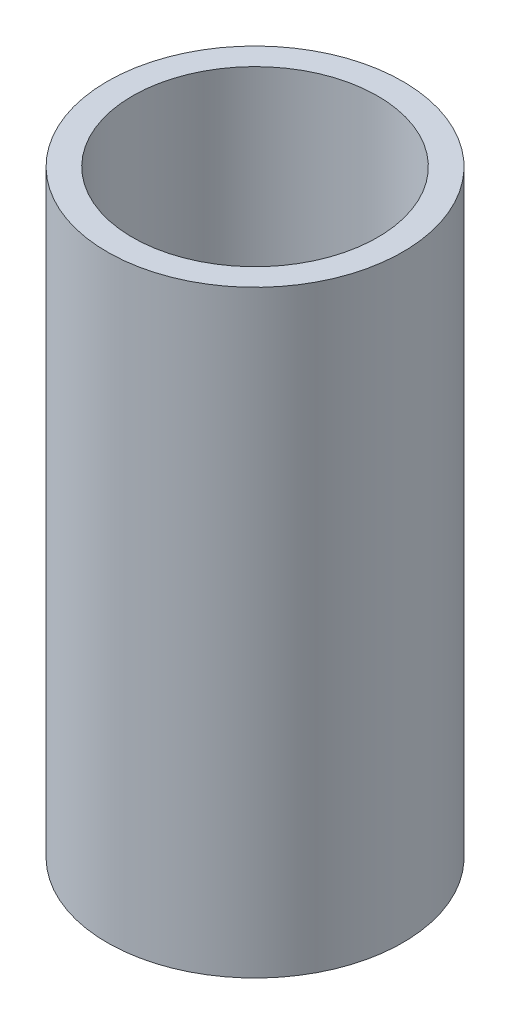
ISO-10303-21;
HEADER;
FILE_DESCRIPTION(('STEP AP214'),'2;1');
FILE_NAME('part.step','',(''),(''),'','','');
FILE_SCHEMA(('AUTOMOTIVE_DESIGN { 1 0 10303 214 1 1 1 1 }'));
ENDSEC;
DATA;
#1=APPLICATION_CONTEXT('core data for automotive mechanical design processes');
#2=APPLICATION_PROTOCOL_DEFINITION('international standard','automotive_design',2000,#1);
#3=PRODUCT_CONTEXT('',#1,'mechanical');
#4=PRODUCT('Part','Part','',(#3));
#5=PRODUCT_RELATED_PRODUCT_CATEGORY('part','',(#4));
#6=PRODUCT_DEFINITION_FORMATION('','',#4);
#7=PRODUCT_DEFINITION_CONTEXT('part definition',#1,'design');
#8=PRODUCT_DEFINITION('design','',#6,#7);
#9=PRODUCT_DEFINITION_SHAPE('','',#8);
#10=(LENGTH_UNIT() NAMED_UNIT(*) SI_UNIT(.MILLI.,.METRE.));
#11=(NAMED_UNIT(*) PLANE_ANGLE_UNIT() SI_UNIT($,.RADIAN.));
#12=(NAMED_UNIT(*) SI_UNIT($,.STERADIAN.) SOLID_ANGLE_UNIT());
#13=UNCERTAINTY_MEASURE_WITH_UNIT(LENGTH_MEASURE(1.E-05),#10,'distance_accuracy_value','');
#14=(GEOMETRIC_REPRESENTATION_CONTEXT(3) GLOBAL_UNCERTAINTY_ASSIGNED_CONTEXT((#13)) GLOBAL_UNIT_ASSIGNED_CONTEXT((#10,
#11,#12)) REPRESENTATION_CONTEXT('',''));
#15=CARTESIAN_POINT('',(0.,0.,0.));
#16=DIRECTION('',(0.,0.,1.));
#17=DIRECTION('',(1.,0.,0.));
#18=AXIS2_PLACEMENT_3D('',#15,#16,#17);
#19=CARTESIAN_POINT('',(0.,7.90302262740136,34.1376));
#20=DIRECTION('',(0.,1.,0.));
#21=DIRECTION('',(-1.,0.,0.));
#22=AXIS2_PLACEMENT_3D('',#19,#20,#21);
#23=CYLINDRICAL_SURFACE('',#22,2.6543);
#24=CARTESIAN_POINT('',(0.,0.,34.1376));
#25=DIRECTION('',(0.,1.,0.));
#26=DIRECTION('',(-1.,0.,0.));
#27=AXIS2_PLACEMENT_3D('',#24,#25,#26);
#28=CIRCLE('',#27,2.6543);
#29=CARTESIAN_POINT('',(-2.6543,0.,34.1376));
#30=VERTEX_POINT('',#29);
#31=EDGE_CURVE('E26',#30,#30,#28,.F.);
#32=ORIENTED_EDGE('',*,*,#31,.F.);
#33=EDGE_LOOP('',(#32));
#34=FACE_BOUND('',#33,.T.);
#35=CARTESIAN_POINT('',(0.,-12.954,34.1376));
#36=DIRECTION('',(0.,1.,0.));
#37=DIRECTION('',(-1.,0.,0.));
#38=AXIS2_PLACEMENT_3D('',#35,#36,#37);
#39=CIRCLE('',#38,2.6543);
#40=CARTESIAN_POINT('',(-2.65430000000001,-12.954,34.1376));
#41=VERTEX_POINT('',#40);
#42=EDGE_CURVE('E17',#41,#41,#39,.T.);
#43=ORIENTED_EDGE('',*,*,#42,.F.);
#44=EDGE_LOOP('',(#43));
#45=FACE_BOUND('',#44,.T.);
#46=ADVANCED_FACE('F14',(#34,#45),#23,.F.);
#47=CARTESIAN_POINT('',(0.,-12.954,36.7919));
#48=DIRECTION('',(0.,-1.,0.));
#49=DIRECTION('',(1.,0.,0.));
#50=AXIS2_PLACEMENT_3D('',#47,#48,#49);
#51=PLANE('',#50);
#52=CARTESIAN_POINT('',(0.,-12.954,34.1376));
#53=DIRECTION('',(0.,1.,0.));
#54=DIRECTION('',(-1.,0.,0.));
#55=AXIS2_PLACEMENT_3D('',#52,#53,#54);
#56=CIRCLE('',#55,3.2004);
#57=CARTESIAN_POINT('',(-3.20040000000002,-12.954,34.1376));
#58=VERTEX_POINT('',#57);
#59=EDGE_CURVE('E21',#58,#58,#56,.T.);
#60=ORIENTED_EDGE('',*,*,#59,.F.);
#61=EDGE_LOOP('',(#60));
#62=FACE_BOUND('',#61,.T.);
#63=ORIENTED_EDGE('',*,*,#42,.T.);
#64=EDGE_LOOP('',(#63));
#65=FACE_BOUND('',#64,.T.);
#66=ADVANCED_FACE('F34',(#62,#65),#51,.T.);
#67=CARTESIAN_POINT('',(0.,0.,36.7919));
#68=DIRECTION('',(0.,1.,0.));
#69=DIRECTION('',(-1.,0.,0.));
#70=AXIS2_PLACEMENT_3D('',#67,#68,#69);
#71=PLANE('',#70);
#72=ORIENTED_EDGE('',*,*,#31,.T.);
#73=EDGE_LOOP('',(#72));
#74=FACE_BOUND('',#73,.T.);
#75=CARTESIAN_POINT('',(0.,0.,34.1376));
#76=DIRECTION('',(0.,1.,0.));
#77=DIRECTION('',(-1.,0.,0.));
#78=AXIS2_PLACEMENT_3D('',#75,#76,#77);
#79=CIRCLE('',#78,3.2004);
#80=CARTESIAN_POINT('',(-3.2004,0.,34.1376));
#81=VERTEX_POINT('',#80);
#82=EDGE_CURVE('E10',#81,#81,#79,.F.);
#83=ORIENTED_EDGE('',*,*,#82,.F.);
#84=EDGE_LOOP('',(#83));
#85=FACE_BOUND('',#84,.T.);
#86=ADVANCED_FACE('F42',(#74,#85),#71,.T.);
#87=CARTESIAN_POINT('',(0.,7.90302262740136,34.1376));
#88=DIRECTION('',(0.,1.,0.));
#89=DIRECTION('',(-1.,0.,0.));
#90=AXIS2_PLACEMENT_3D('',#87,#88,#89);
#91=CYLINDRICAL_SURFACE('',#90,3.2004);
#92=ORIENTED_EDGE('',*,*,#59,.T.);
#93=EDGE_LOOP('',(#92));
#94=FACE_BOUND('',#93,.T.);
#95=ORIENTED_EDGE('',*,*,#82,.T.);
#96=EDGE_LOOP('',(#95));
#97=FACE_BOUND('',#96,.T.);
#98=ADVANCED_FACE('F44',(#94,#97),#91,.T.);
#99=CLOSED_SHELL('',(#46,#66,#86,#98));
#100=MANIFOLD_SOLID_BREP('B1',#99);
#101=ADVANCED_BREP_SHAPE_REPRESENTATION('',(#18,#100),#14);
#102=SHAPE_DEFINITION_REPRESENTATION(#9,#101);
ENDSEC;
END-ISO-10303-21;
